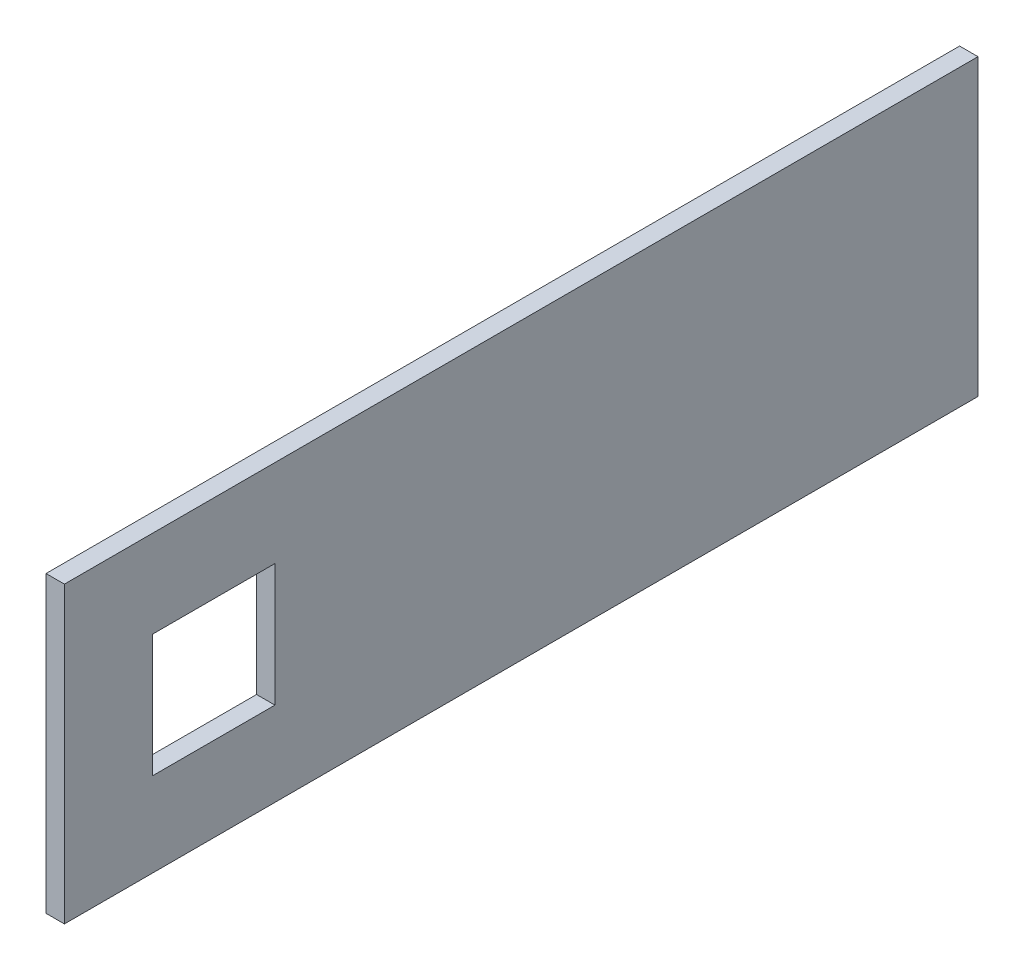
ISO-10303-21;
HEADER;
FILE_DESCRIPTION(('STEP AP214'),'2;1');
FILE_NAME('part.step','',(''),(''),'','','');
FILE_SCHEMA(('AUTOMOTIVE_DESIGN { 1 0 10303 214 1 1 1 1 }'));
ENDSEC;
DATA;
#1=APPLICATION_CONTEXT('core data for automotive mechanical design processes');
#2=APPLICATION_PROTOCOL_DEFINITION('international standard','automotive_design',2000,#1);
#3=PRODUCT_CONTEXT('',#1,'mechanical');
#4=PRODUCT('Part','Part','',(#3));
#5=PRODUCT_RELATED_PRODUCT_CATEGORY('part','',(#4));
#6=PRODUCT_DEFINITION_FORMATION('','',#4);
#7=PRODUCT_DEFINITION_CONTEXT('part definition',#1,'design');
#8=PRODUCT_DEFINITION('design','',#6,#7);
#9=PRODUCT_DEFINITION_SHAPE('','',#8);
#10=(LENGTH_UNIT() NAMED_UNIT(*) SI_UNIT(.MILLI.,.METRE.));
#11=(NAMED_UNIT(*) PLANE_ANGLE_UNIT() SI_UNIT($,.RADIAN.));
#12=(NAMED_UNIT(*) SI_UNIT($,.STERADIAN.) SOLID_ANGLE_UNIT());
#13=UNCERTAINTY_MEASURE_WITH_UNIT(LENGTH_MEASURE(1.E-05),#10,'distance_accuracy_value','');
#14=(GEOMETRIC_REPRESENTATION_CONTEXT(3) GLOBAL_UNCERTAINTY_ASSIGNED_CONTEXT((#13)) GLOBAL_UNIT_ASSIGNED_CONTEXT((#10,
#11,#12)) REPRESENTATION_CONTEXT('',''));
#15=CARTESIAN_POINT('',(0.,0.,0.));
#16=DIRECTION('',(0.,0.,1.));
#17=DIRECTION('',(1.,0.,0.));
#18=AXIS2_PLACEMENT_3D('',#15,#16,#17);
#19=CARTESIAN_POINT('',(3.,0.,0.));
#20=DIRECTION('',(1.,0.,0.));
#21=DIRECTION('',(0.,0.,-1.));
#22=AXIS2_PLACEMENT_3D('',#19,#20,#21);
#23=PLANE('',#22);
#24=DIRECTION('',(0.,1.,0.));
#25=VECTOR('',#24,1.);
#26=CARTESIAN_POINT('',(3.,24.,-74.5));
#27=LINE('',#26,#25);
#28=CARTESIAN_POINT('',(3.,-24.,-74.5));
#29=VERTEX_POINT('',#28);
#30=CARTESIAN_POINT('',(3.,24.,-74.5));
#31=VERTEX_POINT('',#30);
#32=EDGE_CURVE('E138',#29,#31,#27,.T.);
#33=ORIENTED_EDGE('',*,*,#32,.T.);
#34=DIRECTION('',(0.,0.,1.));
#35=VECTOR('',#34,1.);
#36=CARTESIAN_POINT('',(3.,24.,74.5));
#37=LINE('',#36,#35);
#38=CARTESIAN_POINT('',(3.,24.,74.5));
#39=VERTEX_POINT('',#38);
#40=EDGE_CURVE('E141',#31,#39,#37,.T.);
#41=ORIENTED_EDGE('',*,*,#40,.T.);
#42=DIRECTION('',(0.,-1.,0.));
#43=VECTOR('',#42,1.);
#44=CARTESIAN_POINT('',(3.,24.,74.5));
#45=LINE('',#44,#43);
#46=CARTESIAN_POINT('',(3.,-24.,74.5));
#47=VERTEX_POINT('',#46);
#48=EDGE_CURVE('E144',#39,#47,#45,.T.);
#49=ORIENTED_EDGE('',*,*,#48,.T.);
#50=DIRECTION('',(0.,0.,-1.));
#51=VECTOR('',#50,1.);
#52=CARTESIAN_POINT('',(3.,-24.,74.5));
#53=LINE('',#52,#51);
#54=EDGE_CURVE('E146',#47,#29,#53,.T.);
#55=ORIENTED_EDGE('',*,*,#54,.T.);
#56=EDGE_LOOP('',(#33,#41,#49,#55));
#57=FACE_BOUND('',#56,.T.);
#58=DIRECTION('',(0.,0.,1.));
#59=VECTOR('',#58,1.);
#60=CARTESIAN_POINT('',(3.,9.74141884156463,60.1600864375704));
#61=LINE('',#60,#59);
#62=CARTESIAN_POINT('',(3.,9.74141884156463,40.1600864375704));
#63=VERTEX_POINT('',#62);
#64=CARTESIAN_POINT('',(3.,9.74141884156463,60.1600864375704));
#65=VERTEX_POINT('',#64);
#66=EDGE_CURVE('E110',#63,#65,#61,.T.);
#67=ORIENTED_EDGE('',*,*,#66,.F.);
#68=DIRECTION('',(0.,1.,0.));
#69=VECTOR('',#68,1.);
#70=CARTESIAN_POINT('',(3.,9.74141884156463,40.1600864375704));
#71=LINE('',#70,#69);
#72=CARTESIAN_POINT('',(3.,-10.2585811584354,40.1600864375704));
#73=VERTEX_POINT('',#72);
#74=EDGE_CURVE('E102',#73,#63,#71,.T.);
#75=ORIENTED_EDGE('',*,*,#74,.F.);
#76=DIRECTION('',(0.,0.,-1.));
#77=VECTOR('',#76,1.);
#78=CARTESIAN_POINT('',(3.,-10.2585811584354,60.1600864375704));
#79=LINE('',#78,#77);
#80=CARTESIAN_POINT('',(3.,-10.2585811584354,60.1600864375704));
#81=VERTEX_POINT('',#80);
#82=EDGE_CURVE('E124',#81,#73,#79,.T.);
#83=ORIENTED_EDGE('',*,*,#82,.F.);
#84=DIRECTION('',(0.,-1.,0.));
#85=VECTOR('',#84,1.);
#86=CARTESIAN_POINT('',(3.,9.74141884156463,60.1600864375704));
#87=LINE('',#86,#85);
#88=EDGE_CURVE('E122',#65,#81,#87,.T.);
#89=ORIENTED_EDGE('',*,*,#88,.F.);
#90=EDGE_LOOP('',(#67,#75,#83,#89));
#91=FACE_BOUND('',#90,.T.);
#92=ADVANCED_FACE('F37',(#57,#91),#23,.T.);
#93=CARTESIAN_POINT('',(0.,0.,0.));
#94=DIRECTION('',(1.,0.,0.));
#95=DIRECTION('',(0.,0.,-1.));
#96=AXIS2_PLACEMENT_3D('',#93,#94,#95);
#97=PLANE('',#96);
#98=DIRECTION('',(0.,1.,0.));
#99=VECTOR('',#98,1.);
#100=CARTESIAN_POINT('',(0.,24.,-74.5));
#101=LINE('',#100,#99);
#102=CARTESIAN_POINT('',(0.,-24.,-74.5));
#103=VERTEX_POINT('',#102);
#104=CARTESIAN_POINT('',(0.,24.,-74.5));
#105=VERTEX_POINT('',#104);
#106=EDGE_CURVE('E118',#103,#105,#101,.T.);
#107=ORIENTED_EDGE('',*,*,#106,.F.);
#108=DIRECTION('',(0.,0.,-1.));
#109=VECTOR('',#108,1.);
#110=CARTESIAN_POINT('',(0.,-24.,74.5));
#111=LINE('',#110,#109);
#112=CARTESIAN_POINT('',(0.,-24.,74.5));
#113=VERTEX_POINT('',#112);
#114=EDGE_CURVE('E142',#113,#103,#111,.T.);
#115=ORIENTED_EDGE('',*,*,#114,.F.);
#116=DIRECTION('',(0.,-1.,0.));
#117=VECTOR('',#116,1.);
#118=CARTESIAN_POINT('',(0.,24.,74.5));
#119=LINE('',#118,#117);
#120=CARTESIAN_POINT('',(0.,24.,74.5));
#121=VERTEX_POINT('',#120);
#122=EDGE_CURVE('E153',#121,#113,#119,.T.);
#123=ORIENTED_EDGE('',*,*,#122,.F.);
#124=DIRECTION('',(0.,0.,1.));
#125=VECTOR('',#124,1.);
#126=CARTESIAN_POINT('',(0.,24.,74.5));
#127=LINE('',#126,#125);
#128=EDGE_CURVE('E151',#105,#121,#127,.T.);
#129=ORIENTED_EDGE('',*,*,#128,.F.);
#130=EDGE_LOOP('',(#107,#115,#123,#129));
#131=FACE_BOUND('',#130,.T.);
#132=DIRECTION('',(0.,1.,0.));
#133=VECTOR('',#132,1.);
#134=CARTESIAN_POINT('',(0.,9.74141884156463,40.1600864375704));
#135=LINE('',#134,#133);
#136=CARTESIAN_POINT('',(0.,-10.2585811584354,40.1600864375704));
#137=VERTEX_POINT('',#136);
#138=CARTESIAN_POINT('',(0.,9.74141884156463,40.1600864375704));
#139=VERTEX_POINT('',#138);
#140=EDGE_CURVE('E60',#137,#139,#135,.T.);
#141=ORIENTED_EDGE('',*,*,#140,.T.);
#142=DIRECTION('',(0.,0.,1.));
#143=VECTOR('',#142,1.);
#144=CARTESIAN_POINT('',(0.,9.74141884156463,60.1600864375704));
#145=LINE('',#144,#143);
#146=CARTESIAN_POINT('',(0.,9.74141884156463,60.1600864375704));
#147=VERTEX_POINT('',#146);
#148=EDGE_CURVE('E117',#139,#147,#145,.T.);
#149=ORIENTED_EDGE('',*,*,#148,.T.);
#150=DIRECTION('',(0.,-1.,0.));
#151=VECTOR('',#150,1.);
#152=CARTESIAN_POINT('',(0.,9.74141884156463,60.1600864375704));
#153=LINE('',#152,#151);
#154=CARTESIAN_POINT('',(0.,-10.2585811584354,60.1600864375704));
#155=VERTEX_POINT('',#154);
#156=EDGE_CURVE('E130',#147,#155,#153,.T.);
#157=ORIENTED_EDGE('',*,*,#156,.T.);
#158=DIRECTION('',(0.,0.,-1.));
#159=VECTOR('',#158,1.);
#160=CARTESIAN_POINT('',(0.,-10.2585811584354,60.1600864375704));
#161=LINE('',#160,#159);
#162=EDGE_CURVE('E111',#155,#137,#161,.T.);
#163=ORIENTED_EDGE('',*,*,#162,.T.);
#164=EDGE_LOOP('',(#141,#149,#157,#163));
#165=FACE_BOUND('',#164,.T.);
#166=ADVANCED_FACE('F171',(#131,#165),#97,.F.);
#167=CARTESIAN_POINT('',(3.,24.,-74.5));
#168=DIRECTION('',(0.,0.,1.));
#169=DIRECTION('',(1.,0.,0.));
#170=AXIS2_PLACEMENT_3D('',#167,#168,#169);
#171=PLANE('',#170);
#172=ORIENTED_EDGE('',*,*,#106,.T.);
#173=DIRECTION('',(-1.,0.,0.));
#174=VECTOR('',#173,1.);
#175=CARTESIAN_POINT('',(3.,24.,-74.5));
#176=LINE('',#175,#174);
#177=EDGE_CURVE('E11',#31,#105,#176,.T.);
#178=ORIENTED_EDGE('',*,*,#177,.F.);
#179=ORIENTED_EDGE('',*,*,#32,.F.);
#180=DIRECTION('',(-1.,0.,0.));
#181=VECTOR('',#180,1.);
#182=CARTESIAN_POINT('',(3.,-24.,-74.5));
#183=LINE('',#182,#181);
#184=EDGE_CURVE('E148',#29,#103,#183,.T.);
#185=ORIENTED_EDGE('',*,*,#184,.T.);
#186=EDGE_LOOP('',(#172,#178,#179,#185));
#187=FACE_BOUND('',#186,.T.);
#188=ADVANCED_FACE('F39',(#187),#171,.F.);
#189=CARTESIAN_POINT('',(3.,24.,74.5));
#190=DIRECTION('',(0.,-1.,0.));
#191=DIRECTION('',(0.,0.,-1.));
#192=AXIS2_PLACEMENT_3D('',#189,#190,#191);
#193=PLANE('',#192);
#194=ORIENTED_EDGE('',*,*,#128,.T.);
#195=DIRECTION('',(-1.,0.,0.));
#196=VECTOR('',#195,1.);
#197=CARTESIAN_POINT('',(3.,24.,74.5));
#198=LINE('',#197,#196);
#199=EDGE_CURVE('E45',#39,#121,#198,.T.);
#200=ORIENTED_EDGE('',*,*,#199,.F.);
#201=ORIENTED_EDGE('',*,*,#40,.F.);
#202=ORIENTED_EDGE('',*,*,#177,.T.);
#203=EDGE_LOOP('',(#194,#200,#201,#202));
#204=FACE_BOUND('',#203,.T.);
#205=ADVANCED_FACE('F181',(#204),#193,.F.);
#206=CARTESIAN_POINT('',(3.,24.,74.5));
#207=DIRECTION('',(0.,0.,-1.));
#208=DIRECTION('',(0.,1.,0.));
#209=AXIS2_PLACEMENT_3D('',#206,#207,#208);
#210=PLANE('',#209);
#211=ORIENTED_EDGE('',*,*,#122,.T.);
#212=DIRECTION('',(-1.,0.,0.));
#213=VECTOR('',#212,1.);
#214=CARTESIAN_POINT('',(3.,-24.,74.5));
#215=LINE('',#214,#213);
#216=EDGE_CURVE('E158',#47,#113,#215,.T.);
#217=ORIENTED_EDGE('',*,*,#216,.F.);
#218=ORIENTED_EDGE('',*,*,#48,.F.);
#219=ORIENTED_EDGE('',*,*,#199,.T.);
#220=EDGE_LOOP('',(#211,#217,#218,#219));
#221=FACE_BOUND('',#220,.T.);
#222=ADVANCED_FACE('F165',(#221),#210,.F.);
#223=CARTESIAN_POINT('',(3.,-24.,74.5));
#224=DIRECTION('',(0.,1.,0.));
#225=DIRECTION('',(0.,0.,1.));
#226=AXIS2_PLACEMENT_3D('',#223,#224,#225);
#227=PLANE('',#226);
#228=ORIENTED_EDGE('',*,*,#114,.T.);
#229=ORIENTED_EDGE('',*,*,#184,.F.);
#230=ORIENTED_EDGE('',*,*,#54,.F.);
#231=ORIENTED_EDGE('',*,*,#216,.T.);
#232=EDGE_LOOP('',(#228,#229,#230,#231));
#233=FACE_BOUND('',#232,.T.);
#234=ADVANCED_FACE('F175',(#233),#227,.F.);
#235=CARTESIAN_POINT('',(3.,9.74141884156463,40.1600864375704));
#236=DIRECTION('',(0.,0.,1.));
#237=DIRECTION('',(1.,0.,0.));
#238=AXIS2_PLACEMENT_3D('',#235,#236,#237);
#239=PLANE('',#238);
#240=ORIENTED_EDGE('',*,*,#140,.F.);
#241=DIRECTION('',(-1.,0.,0.));
#242=VECTOR('',#241,1.);
#243=CARTESIAN_POINT('',(3.,-10.2585811584354,40.1600864375704));
#244=LINE('',#243,#242);
#245=EDGE_CURVE('E106',#73,#137,#244,.T.);
#246=ORIENTED_EDGE('',*,*,#245,.F.);
#247=ORIENTED_EDGE('',*,*,#74,.T.);
#248=DIRECTION('',(-1.,0.,0.));
#249=VECTOR('',#248,1.);
#250=CARTESIAN_POINT('',(3.,9.74141884156463,40.1600864375704));
#251=LINE('',#250,#249);
#252=EDGE_CURVE('E105',#63,#139,#251,.T.);
#253=ORIENTED_EDGE('',*,*,#252,.T.);
#254=EDGE_LOOP('',(#240,#246,#247,#253));
#255=FACE_BOUND('',#254,.T.);
#256=ADVANCED_FACE('F104',(#255),#239,.T.);
#257=CARTESIAN_POINT('',(3.,9.74141884156463,60.1600864375704));
#258=DIRECTION('',(0.,-1.,0.));
#259=DIRECTION('',(0.,0.,-1.));
#260=AXIS2_PLACEMENT_3D('',#257,#258,#259);
#261=PLANE('',#260);
#262=ORIENTED_EDGE('',*,*,#148,.F.);
#263=ORIENTED_EDGE('',*,*,#252,.F.);
#264=ORIENTED_EDGE('',*,*,#66,.T.);
#265=DIRECTION('',(-1.,0.,0.));
#266=VECTOR('',#265,1.);
#267=CARTESIAN_POINT('',(3.,9.74141884156463,60.1600864375704));
#268=LINE('',#267,#266);
#269=EDGE_CURVE('E119',#65,#147,#268,.T.);
#270=ORIENTED_EDGE('',*,*,#269,.T.);
#271=EDGE_LOOP('',(#262,#263,#264,#270));
#272=FACE_BOUND('',#271,.T.);
#273=ADVANCED_FACE('F114',(#272),#261,.T.);
#274=CARTESIAN_POINT('',(3.,9.74141884156463,60.1600864375704));
#275=DIRECTION('',(0.,0.,-1.));
#276=DIRECTION('',(-1.,0.,0.));
#277=AXIS2_PLACEMENT_3D('',#274,#275,#276);
#278=PLANE('',#277);
#279=ORIENTED_EDGE('',*,*,#156,.F.);
#280=ORIENTED_EDGE('',*,*,#269,.F.);
#281=ORIENTED_EDGE('',*,*,#88,.T.);
#282=DIRECTION('',(-1.,0.,0.));
#283=VECTOR('',#282,1.);
#284=CARTESIAN_POINT('',(3.,-10.2585811584354,60.1600864375704));
#285=LINE('',#284,#283);
#286=EDGE_CURVE('E52',#81,#155,#285,.T.);
#287=ORIENTED_EDGE('',*,*,#286,.T.);
#288=EDGE_LOOP('',(#279,#280,#281,#287));
#289=FACE_BOUND('',#288,.T.);
#290=ADVANCED_FACE('F204',(#289),#278,.T.);
#291=CARTESIAN_POINT('',(3.,-10.2585811584354,60.1600864375704));
#292=DIRECTION('',(0.,1.,0.));
#293=DIRECTION('',(0.,0.,1.));
#294=AXIS2_PLACEMENT_3D('',#291,#292,#293);
#295=PLANE('',#294);
#296=ORIENTED_EDGE('',*,*,#162,.F.);
#297=ORIENTED_EDGE('',*,*,#286,.F.);
#298=ORIENTED_EDGE('',*,*,#82,.T.);
#299=ORIENTED_EDGE('',*,*,#245,.T.);
#300=EDGE_LOOP('',(#296,#297,#298,#299));
#301=FACE_BOUND('',#300,.T.);
#302=ADVANCED_FACE('F208',(#301),#295,.T.);
#303=CLOSED_SHELL('',(#92,#166,#188,#205,#222,#234,#256,#273,#290,#302));
#304=MANIFOLD_SOLID_BREP('B2',#303);
#305=ADVANCED_BREP_SHAPE_REPRESENTATION('',(#18,#304),#14);
#306=SHAPE_DEFINITION_REPRESENTATION(#9,#305);
ENDSEC;
END-ISO-10303-21;
